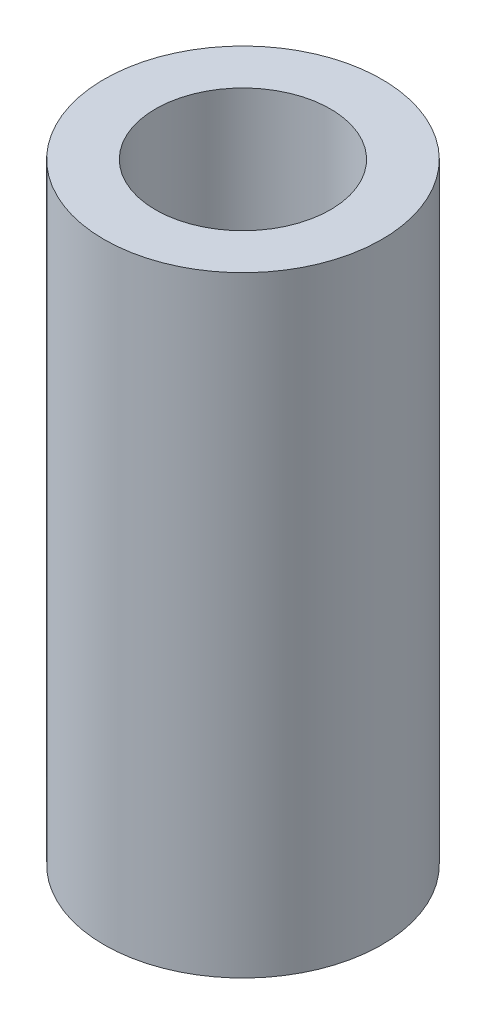
ISO-10303-21;
HEADER;
FILE_DESCRIPTION(('STEP AP214'),'2;1');
FILE_NAME('part.step','',(''),(''),'','','');
FILE_SCHEMA(('AUTOMOTIVE_DESIGN { 1 0 10303 214 1 1 1 1 }'));
ENDSEC;
DATA;
#1=APPLICATION_CONTEXT('core data for automotive mechanical design processes');
#2=APPLICATION_PROTOCOL_DEFINITION('international standard','automotive_design',2000,#1);
#3=PRODUCT_CONTEXT('',#1,'mechanical');
#4=PRODUCT('Part','Part','',(#3));
#5=PRODUCT_RELATED_PRODUCT_CATEGORY('part','',(#4));
#6=PRODUCT_DEFINITION_FORMATION('','',#4);
#7=PRODUCT_DEFINITION_CONTEXT('part definition',#1,'design');
#8=PRODUCT_DEFINITION('design','',#6,#7);
#9=PRODUCT_DEFINITION_SHAPE('','',#8);
#10=(LENGTH_UNIT() NAMED_UNIT(*) SI_UNIT(.MILLI.,.METRE.));
#11=(NAMED_UNIT(*) PLANE_ANGLE_UNIT() SI_UNIT($,.RADIAN.));
#12=(NAMED_UNIT(*) SI_UNIT($,.STERADIAN.) SOLID_ANGLE_UNIT());
#13=UNCERTAINTY_MEASURE_WITH_UNIT(LENGTH_MEASURE(1.E-05),#10,'distance_accuracy_value','');
#14=(GEOMETRIC_REPRESENTATION_CONTEXT(3) GLOBAL_UNCERTAINTY_ASSIGNED_CONTEXT((#13)) GLOBAL_UNIT_ASSIGNED_CONTEXT((#10,
#11,#12)) REPRESENTATION_CONTEXT('',''));
#15=CARTESIAN_POINT('',(0.,0.,0.));
#16=DIRECTION('',(0.,0.,1.));
#17=DIRECTION('',(1.,0.,0.));
#18=AXIS2_PLACEMENT_3D('',#15,#16,#17);
#19=CARTESIAN_POINT('',(0.,-13.97,0.));
#20=DIRECTION('',(0.,1.,0.));
#21=DIRECTION('',(0.,0.,1.));
#22=AXIS2_PLACEMENT_3D('',#19,#20,#21);
#23=CYLINDRICAL_SURFACE('',#22,3.175);
#24=CARTESIAN_POINT('',(0.,-13.97,0.));
#25=DIRECTION('',(0.,1.,0.));
#26=DIRECTION('',(0.,0.,1.));
#27=AXIS2_PLACEMENT_3D('',#24,#25,#26);
#28=CIRCLE('',#27,3.175);
#29=CARTESIAN_POINT('',(0.,-13.97,3.175));
#30=VERTEX_POINT('',#29);
#31=EDGE_CURVE('E10',#30,#30,#28,.T.);
#32=ORIENTED_EDGE('',*,*,#31,.T.);
#33=EDGE_LOOP('',(#32));
#34=FACE_BOUND('',#33,.T.);
#35=CARTESIAN_POINT('',(0.,0.,0.));
#36=DIRECTION('',(0.,1.,0.));
#37=DIRECTION('',(0.,0.,1.));
#38=AXIS2_PLACEMENT_3D('',#35,#36,#37);
#39=CIRCLE('',#38,3.175);
#40=CARTESIAN_POINT('',(0.,0.,3.175));
#41=VERTEX_POINT('',#40);
#42=EDGE_CURVE('E42',#41,#41,#39,.T.);
#43=ORIENTED_EDGE('',*,*,#42,.F.);
#44=EDGE_LOOP('',(#43));
#45=FACE_BOUND('',#44,.T.);
#46=ADVANCED_FACE('F39',(#34,#45),#23,.T.);
#47=CARTESIAN_POINT('',(0.,-13.97,0.));
#48=DIRECTION('',(0.,1.,0.));
#49=DIRECTION('',(0.,0.,1.));
#50=AXIS2_PLACEMENT_3D('',#47,#48,#49);
#51=PLANE('',#50);
#52=CARTESIAN_POINT('',(0.,-13.97,0.));
#53=DIRECTION('',(0.,1.,0.));
#54=DIRECTION('',(0.,0.,1.));
#55=AXIS2_PLACEMENT_3D('',#52,#53,#54);
#56=CIRCLE('',#55,1.999996);
#57=CARTESIAN_POINT('',(0.,-13.97,1.999996));
#58=VERTEX_POINT('',#57);
#59=EDGE_CURVE('E49',#58,#58,#56,.T.);
#60=ORIENTED_EDGE('',*,*,#59,.T.);
#61=EDGE_LOOP('',(#60));
#62=FACE_BOUND('',#61,.T.);
#63=ORIENTED_EDGE('',*,*,#31,.F.);
#64=EDGE_LOOP('',(#63));
#65=FACE_BOUND('',#64,.T.);
#66=ADVANCED_FACE('F57',(#62,#65),#51,.F.);
#67=CARTESIAN_POINT('',(0.,0.,0.));
#68=DIRECTION('',(0.,1.,0.));
#69=DIRECTION('',(0.,0.,1.));
#70=AXIS2_PLACEMENT_3D('',#67,#68,#69);
#71=PLANE('',#70);
#72=CARTESIAN_POINT('',(0.,0.,0.));
#73=DIRECTION('',(0.,1.,0.));
#74=DIRECTION('',(0.,0.,1.));
#75=AXIS2_PLACEMENT_3D('',#72,#73,#74);
#76=CIRCLE('',#75,1.999996);
#77=CARTESIAN_POINT('',(0.,0.,1.999996));
#78=VERTEX_POINT('',#77);
#79=EDGE_CURVE('E51',#78,#78,#76,.T.);
#80=ORIENTED_EDGE('',*,*,#79,.F.);
#81=EDGE_LOOP('',(#80));
#82=FACE_BOUND('',#81,.T.);
#83=ORIENTED_EDGE('',*,*,#42,.T.);
#84=EDGE_LOOP('',(#83));
#85=FACE_BOUND('',#84,.T.);
#86=ADVANCED_FACE('F63',(#82,#85),#71,.T.);
#87=CARTESIAN_POINT('',(0.,-13.97,0.));
#88=DIRECTION('',(0.,1.,0.));
#89=DIRECTION('',(0.,0.,1.));
#90=AXIS2_PLACEMENT_3D('',#87,#88,#89);
#91=CYLINDRICAL_SURFACE('',#90,1.999996);
#92=ORIENTED_EDGE('',*,*,#59,.F.);
#93=EDGE_LOOP('',(#92));
#94=FACE_BOUND('',#93,.T.);
#95=ORIENTED_EDGE('',*,*,#79,.T.);
#96=EDGE_LOOP('',(#95));
#97=FACE_BOUND('',#96,.T.);
#98=ADVANCED_FACE('F60',(#94,#97),#91,.F.);
#99=CLOSED_SHELL('',(#46,#66,#86,#98));
#100=MANIFOLD_SOLID_BREP('B2',#99);
#101=ADVANCED_BREP_SHAPE_REPRESENTATION('',(#18,#100),#14);
#102=SHAPE_DEFINITION_REPRESENTATION(#9,#101);
ENDSEC;
END-ISO-10303-21;
